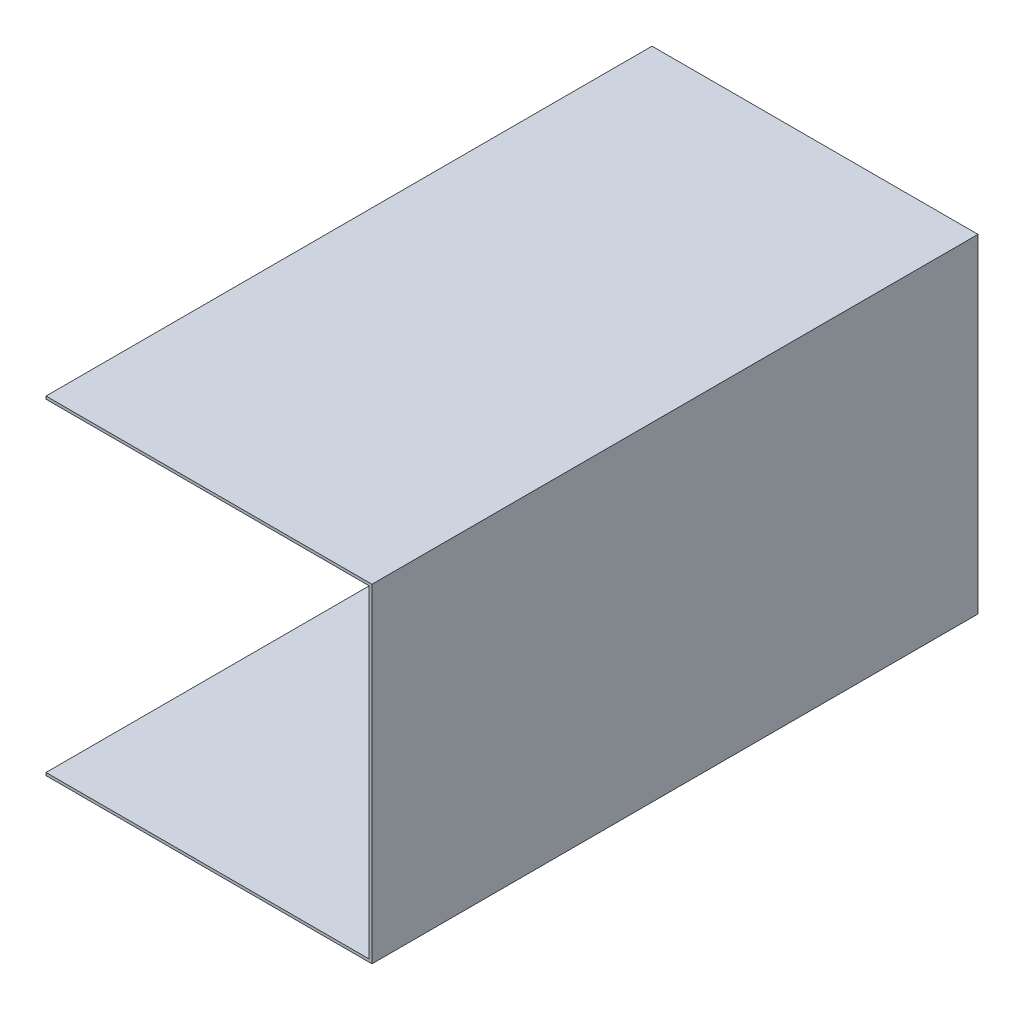
ISO-10303-21;
HEADER;
FILE_DESCRIPTION(('STEP AP214'),'2;1');
FILE_NAME('part.step','',(''),(''),'','','');
FILE_SCHEMA(('AUTOMOTIVE_DESIGN { 1 0 10303 214 1 1 1 1 }'));
ENDSEC;
DATA;
#1=APPLICATION_CONTEXT('core data for automotive mechanical design processes');
#2=APPLICATION_PROTOCOL_DEFINITION('international standard','automotive_design',2000,#1);
#3=PRODUCT_CONTEXT('',#1,'mechanical');
#4=PRODUCT('Part','Part','',(#3));
#5=PRODUCT_RELATED_PRODUCT_CATEGORY('part','',(#4));
#6=PRODUCT_DEFINITION_FORMATION('','',#4);
#7=PRODUCT_DEFINITION_CONTEXT('part definition',#1,'design');
#8=PRODUCT_DEFINITION('design','',#6,#7);
#9=PRODUCT_DEFINITION_SHAPE('','',#8);
#10=(LENGTH_UNIT() NAMED_UNIT(*) SI_UNIT(.MILLI.,.METRE.));
#11=(NAMED_UNIT(*) PLANE_ANGLE_UNIT() SI_UNIT($,.RADIAN.));
#12=(NAMED_UNIT(*) SI_UNIT($,.STERADIAN.) SOLID_ANGLE_UNIT());
#13=UNCERTAINTY_MEASURE_WITH_UNIT(LENGTH_MEASURE(1.E-05),#10,'distance_accuracy_value','');
#14=(GEOMETRIC_REPRESENTATION_CONTEXT(3) GLOBAL_UNCERTAINTY_ASSIGNED_CONTEXT((#13)) GLOBAL_UNIT_ASSIGNED_CONTEXT((#10,
#11,#12)) REPRESENTATION_CONTEXT('',''));
#15=CARTESIAN_POINT('',(0.,0.,0.));
#16=DIRECTION('',(0.,0.,1.));
#17=DIRECTION('',(1.,0.,0.));
#18=AXIS2_PLACEMENT_3D('',#15,#16,#17);
#19=CARTESIAN_POINT('',(-320.,0.,1200.));
#20=DIRECTION('',(-1.,0.,0.));
#21=DIRECTION('',(0.,0.,1.));
#22=AXIS2_PLACEMENT_3D('',#19,#20,#21);
#23=PLANE('',#22);
#24=DIRECTION('',(0.,1.,0.));
#25=VECTOR('',#24,1.);
#26=CARTESIAN_POINT('',(-320.,0.,0.));
#27=LINE('',#26,#25);
#28=CARTESIAN_POINT('',(-320.,320.,0.));
#29=VERTEX_POINT('',#28);
#30=CARTESIAN_POINT('',(-320.,325.5,0.));
#31=VERTEX_POINT('',#30);
#32=EDGE_CURVE('E147',#29,#31,#27,.T.);
#33=ORIENTED_EDGE('',*,*,#32,.F.);
#34=DIRECTION('',(0.,0.,-1.));
#35=VECTOR('',#34,1.);
#36=CARTESIAN_POINT('',(-320.,320.,1200.));
#37=LINE('',#36,#35);
#38=CARTESIAN_POINT('',(-320.,320.,1200.));
#39=VERTEX_POINT('',#38);
#40=EDGE_CURVE('E11',#39,#29,#37,.T.);
#41=ORIENTED_EDGE('',*,*,#40,.F.);
#42=DIRECTION('',(0.,1.,0.));
#43=VECTOR('',#42,1.);
#44=CARTESIAN_POINT('',(-320.,0.,1200.));
#45=LINE('',#44,#43);
#46=CARTESIAN_POINT('',(-320.,325.5,1200.));
#47=VERTEX_POINT('',#46);
#48=EDGE_CURVE('E174',#39,#47,#45,.T.);
#49=ORIENTED_EDGE('',*,*,#48,.T.);
#50=DIRECTION('',(0.,0.,-1.));
#51=VECTOR('',#50,1.);
#52=CARTESIAN_POINT('',(-320.,325.5,1200.));
#53=LINE('',#52,#51);
#54=EDGE_CURVE('E64',#47,#31,#53,.T.);
#55=ORIENTED_EDGE('',*,*,#54,.T.);
#56=EDGE_LOOP('',(#33,#41,#49,#55));
#57=FACE_BOUND('',#56,.T.);
#58=ADVANCED_FACE('F47',(#57),#23,.T.);
#59=CARTESIAN_POINT('',(0.,320.,1200.));
#60=DIRECTION('',(0.,1.,0.));
#61=DIRECTION('',(0.,0.,1.));
#62=AXIS2_PLACEMENT_3D('',#59,#60,#61);
#63=PLANE('',#62);
#64=DIRECTION('',(1.,0.,0.));
#65=VECTOR('',#64,1.);
#66=CARTESIAN_POINT('',(0.,320.,0.));
#67=LINE('',#66,#65);
#68=CARTESIAN_POINT('',(320.,320.,0.));
#69=VERTEX_POINT('',#68);
#70=EDGE_CURVE('E150',#29,#69,#67,.T.);
#71=ORIENTED_EDGE('',*,*,#70,.T.);
#72=DIRECTION('',(0.,0.,-1.));
#73=VECTOR('',#72,1.);
#74=CARTESIAN_POINT('',(320.,320.,1200.));
#75=LINE('',#74,#73);
#76=CARTESIAN_POINT('',(320.,320.,1200.));
#77=VERTEX_POINT('',#76);
#78=EDGE_CURVE('E56',#77,#69,#75,.T.);
#79=ORIENTED_EDGE('',*,*,#78,.F.);
#80=DIRECTION('',(1.,0.,0.));
#81=VECTOR('',#80,1.);
#82=CARTESIAN_POINT('',(0.,320.,1200.));
#83=LINE('',#82,#81);
#84=EDGE_CURVE('E205',#39,#77,#83,.T.);
#85=ORIENTED_EDGE('',*,*,#84,.F.);
#86=ORIENTED_EDGE('',*,*,#40,.T.);
#87=EDGE_LOOP('',(#71,#79,#85,#86));
#88=FACE_BOUND('',#87,.T.);
#89=ADVANCED_FACE('F196',(#88),#63,.F.);
#90=CARTESIAN_POINT('',(320.,0.,1200.));
#91=DIRECTION('',(-1.,0.,0.));
#92=DIRECTION('',(0.,0.,1.));
#93=AXIS2_PLACEMENT_3D('',#90,#91,#92);
#94=PLANE('',#93);
#95=DIRECTION('',(0.,1.,0.));
#96=VECTOR('',#95,1.);
#97=CARTESIAN_POINT('',(320.,0.,0.));
#98=LINE('',#97,#96);
#99=CARTESIAN_POINT('',(320.,-320.,0.));
#100=VERTEX_POINT('',#99);
#101=EDGE_CURVE('E154',#100,#69,#98,.T.);
#102=ORIENTED_EDGE('',*,*,#101,.F.);
#103=DIRECTION('',(0.,0.,-1.));
#104=VECTOR('',#103,1.);
#105=CARTESIAN_POINT('',(320.,-320.,1200.));
#106=LINE('',#105,#104);
#107=CARTESIAN_POINT('',(320.,-320.,1200.));
#108=VERTEX_POINT('',#107);
#109=EDGE_CURVE('E184',#108,#100,#106,.T.);
#110=ORIENTED_EDGE('',*,*,#109,.F.);
#111=DIRECTION('',(0.,1.,0.));
#112=VECTOR('',#111,1.);
#113=CARTESIAN_POINT('',(320.,0.,1200.));
#114=LINE('',#113,#112);
#115=EDGE_CURVE('E193',#108,#77,#114,.T.);
#116=ORIENTED_EDGE('',*,*,#115,.T.);
#117=ORIENTED_EDGE('',*,*,#78,.T.);
#118=EDGE_LOOP('',(#102,#110,#116,#117));
#119=FACE_BOUND('',#118,.T.);
#120=ADVANCED_FACE('F191',(#119),#94,.T.);
#121=CARTESIAN_POINT('',(0.,-320.,1200.));
#122=DIRECTION('',(0.,1.,0.));
#123=DIRECTION('',(0.,0.,1.));
#124=AXIS2_PLACEMENT_3D('',#121,#122,#123);
#125=PLANE('',#124);
#126=DIRECTION('',(1.,0.,0.));
#127=VECTOR('',#126,1.);
#128=CARTESIAN_POINT('',(0.,-320.,0.));
#129=LINE('',#128,#127);
#130=CARTESIAN_POINT('',(-320.,-320.,0.));
#131=VERTEX_POINT('',#130);
#132=EDGE_CURVE('E158',#131,#100,#129,.T.);
#133=ORIENTED_EDGE('',*,*,#132,.F.);
#134=DIRECTION('',(0.,0.,-1.));
#135=VECTOR('',#134,1.);
#136=CARTESIAN_POINT('',(-320.,-320.,1200.));
#137=LINE('',#136,#135);
#138=CARTESIAN_POINT('',(-320.,-320.,1200.));
#139=VERTEX_POINT('',#138);
#140=EDGE_CURVE('E181',#139,#131,#137,.T.);
#141=ORIENTED_EDGE('',*,*,#140,.F.);
#142=DIRECTION('',(1.,0.,0.));
#143=VECTOR('',#142,1.);
#144=CARTESIAN_POINT('',(0.,-320.,1200.));
#145=LINE('',#144,#143);
#146=EDGE_CURVE('E204',#139,#108,#145,.T.);
#147=ORIENTED_EDGE('',*,*,#146,.T.);
#148=ORIENTED_EDGE('',*,*,#109,.T.);
#149=EDGE_LOOP('',(#133,#141,#147,#148));
#150=FACE_BOUND('',#149,.T.);
#151=ADVANCED_FACE('F202',(#150),#125,.T.);
#152=CARTESIAN_POINT('',(-320.,0.,1200.));
#153=DIRECTION('',(1.,0.,0.));
#154=DIRECTION('',(0.,0.,-1.));
#155=AXIS2_PLACEMENT_3D('',#152,#153,#154);
#156=PLANE('',#155);
#157=DIRECTION('',(0.,-1.,0.));
#158=VECTOR('',#157,1.);
#159=CARTESIAN_POINT('',(-320.,0.,0.));
#160=LINE('',#159,#158);
#161=CARTESIAN_POINT('',(-320.,-325.5,0.));
#162=VERTEX_POINT('',#161);
#163=EDGE_CURVE('E162',#131,#162,#160,.T.);
#164=ORIENTED_EDGE('',*,*,#163,.T.);
#165=DIRECTION('',(0.,0.,-1.));
#166=VECTOR('',#165,1.);
#167=CARTESIAN_POINT('',(-320.,-325.5,1200.));
#168=LINE('',#167,#166);
#169=CARTESIAN_POINT('',(-320.,-325.5,1200.));
#170=VERTEX_POINT('',#169);
#171=EDGE_CURVE('E137',#170,#162,#168,.T.);
#172=ORIENTED_EDGE('',*,*,#171,.F.);
#173=DIRECTION('',(0.,-1.,0.));
#174=VECTOR('',#173,1.);
#175=CARTESIAN_POINT('',(-320.,0.,1200.));
#176=LINE('',#175,#174);
#177=EDGE_CURVE('E123',#139,#170,#176,.T.);
#178=ORIENTED_EDGE('',*,*,#177,.F.);
#179=ORIENTED_EDGE('',*,*,#140,.T.);
#180=EDGE_LOOP('',(#164,#172,#178,#179));
#181=FACE_BOUND('',#180,.T.);
#182=ADVANCED_FACE('F236',(#181),#156,.F.);
#183=CARTESIAN_POINT('',(0.,-325.5,1200.));
#184=DIRECTION('',(0.,1.,0.));
#185=DIRECTION('',(-1.,0.,0.));
#186=AXIS2_PLACEMENT_3D('',#183,#184,#185);
#187=PLANE('',#186);
#188=DIRECTION('',(1.,0.,0.));
#189=VECTOR('',#188,1.);
#190=CARTESIAN_POINT('',(0.,-325.5,0.));
#191=LINE('',#190,#189);
#192=CARTESIAN_POINT('',(325.5,-325.5,0.));
#193=VERTEX_POINT('',#192);
#194=EDGE_CURVE('E133',#162,#193,#191,.T.);
#195=ORIENTED_EDGE('',*,*,#194,.T.);
#196=DIRECTION('',(0.,0.,-1.));
#197=VECTOR('',#196,1.);
#198=CARTESIAN_POINT('',(325.5,-325.5,1200.));
#199=LINE('',#198,#197);
#200=CARTESIAN_POINT('',(325.5,-325.5,1200.));
#201=VERTEX_POINT('',#200);
#202=EDGE_CURVE('E130',#201,#193,#199,.T.);
#203=ORIENTED_EDGE('',*,*,#202,.F.);
#204=DIRECTION('',(1.,0.,0.));
#205=VECTOR('',#204,1.);
#206=CARTESIAN_POINT('',(0.,-325.5,1200.));
#207=LINE('',#206,#205);
#208=EDGE_CURVE('E114',#170,#201,#207,.T.);
#209=ORIENTED_EDGE('',*,*,#208,.F.);
#210=ORIENTED_EDGE('',*,*,#171,.T.);
#211=EDGE_LOOP('',(#195,#203,#209,#210));
#212=FACE_BOUND('',#211,.T.);
#213=ADVANCED_FACE('F131',(#212),#187,.F.);
#214=CARTESIAN_POINT('',(325.5,0.,1200.));
#215=DIRECTION('',(-1.,0.,0.));
#216=DIRECTION('',(0.,0.,1.));
#217=AXIS2_PLACEMENT_3D('',#214,#215,#216);
#218=PLANE('',#217);
#219=DIRECTION('',(0.,1.,0.));
#220=VECTOR('',#219,1.);
#221=CARTESIAN_POINT('',(325.5,0.,0.));
#222=LINE('',#221,#220);
#223=CARTESIAN_POINT('',(325.5,325.5,0.));
#224=VERTEX_POINT('',#223);
#225=EDGE_CURVE('E167',#193,#224,#222,.T.);
#226=ORIENTED_EDGE('',*,*,#225,.T.);
#227=DIRECTION('',(0.,0.,-1.));
#228=VECTOR('',#227,1.);
#229=CARTESIAN_POINT('',(325.5,325.5,1200.));
#230=LINE('',#229,#228);
#231=CARTESIAN_POINT('',(325.5,325.5,1200.));
#232=VERTEX_POINT('',#231);
#233=EDGE_CURVE('E90',#232,#224,#230,.T.);
#234=ORIENTED_EDGE('',*,*,#233,.F.);
#235=DIRECTION('',(0.,1.,0.));
#236=VECTOR('',#235,1.);
#237=CARTESIAN_POINT('',(325.5,0.,1200.));
#238=LINE('',#237,#236);
#239=EDGE_CURVE('E120',#201,#232,#238,.T.);
#240=ORIENTED_EDGE('',*,*,#239,.F.);
#241=ORIENTED_EDGE('',*,*,#202,.T.);
#242=EDGE_LOOP('',(#226,#234,#240,#241));
#243=FACE_BOUND('',#242,.T.);
#244=ADVANCED_FACE('F139',(#243),#218,.F.);
#245=CARTESIAN_POINT('',(0.,325.5,1200.));
#246=DIRECTION('',(0.,1.,0.));
#247=DIRECTION('',(0.,0.,1.));
#248=AXIS2_PLACEMENT_3D('',#245,#246,#247);
#249=PLANE('',#248);
#250=DIRECTION('',(1.,0.,0.));
#251=VECTOR('',#250,1.);
#252=CARTESIAN_POINT('',(0.,325.5,0.));
#253=LINE('',#252,#251);
#254=EDGE_CURVE('E170',#31,#224,#253,.T.);
#255=ORIENTED_EDGE('',*,*,#254,.F.);
#256=ORIENTED_EDGE('',*,*,#54,.F.);
#257=DIRECTION('',(1.,0.,0.));
#258=VECTOR('',#257,1.);
#259=CARTESIAN_POINT('',(0.,325.5,1200.));
#260=LINE('',#259,#258);
#261=EDGE_CURVE('E141',#47,#232,#260,.T.);
#262=ORIENTED_EDGE('',*,*,#261,.T.);
#263=ORIENTED_EDGE('',*,*,#233,.T.);
#264=EDGE_LOOP('',(#255,#256,#262,#263));
#265=FACE_BOUND('',#264,.T.);
#266=ADVANCED_FACE('F215',(#265),#249,.T.);
#267=CARTESIAN_POINT('',(0.,0.,1200.));
#268=DIRECTION('',(0.,0.,1.));
#269=DIRECTION('',(1.,0.,0.));
#270=AXIS2_PLACEMENT_3D('',#267,#268,#269);
#271=PLANE('',#270);
#272=ORIENTED_EDGE('',*,*,#48,.F.);
#273=ORIENTED_EDGE('',*,*,#84,.T.);
#274=ORIENTED_EDGE('',*,*,#115,.F.);
#275=ORIENTED_EDGE('',*,*,#146,.F.);
#276=ORIENTED_EDGE('',*,*,#177,.T.);
#277=ORIENTED_EDGE('',*,*,#208,.T.);
#278=ORIENTED_EDGE('',*,*,#239,.T.);
#279=ORIENTED_EDGE('',*,*,#261,.F.);
#280=EDGE_LOOP('',(#272,#273,#274,#275,#276,#277,#278,#279));
#281=FACE_BOUND('',#280,.T.);
#282=ADVANCED_FACE('F117',(#281),#271,.T.);
#283=CARTESIAN_POINT('',(0.,0.,0.));
#284=DIRECTION('',(0.,0.,1.));
#285=DIRECTION('',(1.,0.,0.));
#286=AXIS2_PLACEMENT_3D('',#283,#284,#285);
#287=PLANE('',#286);
#288=ORIENTED_EDGE('',*,*,#32,.T.);
#289=ORIENTED_EDGE('',*,*,#254,.T.);
#290=ORIENTED_EDGE('',*,*,#225,.F.);
#291=ORIENTED_EDGE('',*,*,#194,.F.);
#292=ORIENTED_EDGE('',*,*,#163,.F.);
#293=ORIENTED_EDGE('',*,*,#132,.T.);
#294=ORIENTED_EDGE('',*,*,#101,.T.);
#295=ORIENTED_EDGE('',*,*,#70,.F.);
#296=EDGE_LOOP('',(#288,#289,#290,#291,#292,#293,#294,#295));
#297=FACE_BOUND('',#296,.T.);
#298=ADVANCED_FACE('F198',(#297),#287,.F.);
#299=CLOSED_SHELL('',(#58,#89,#120,#151,#182,#213,#244,#266,#282,#298));
#300=MANIFOLD_SOLID_BREP('B2',#299);
#301=ADVANCED_BREP_SHAPE_REPRESENTATION('',(#18,#300),#14);
#302=SHAPE_DEFINITION_REPRESENTATION(#9,#301);
ENDSEC;
END-ISO-10303-21;
